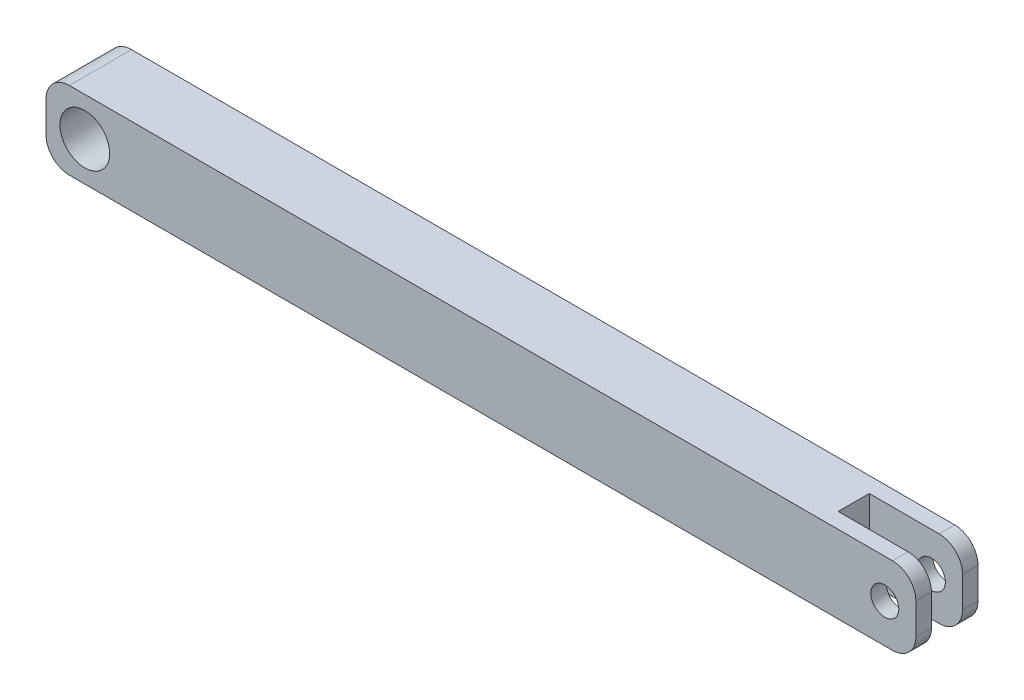
ISO-10303-21;
HEADER;
FILE_DESCRIPTION(('STEP AP214'),'2;1');
FILE_NAME('part.step','',(''),(''),'','','');
FILE_SCHEMA(('AUTOMOTIVE_DESIGN { 1 0 10303 214 1 1 1 1 }'));
ENDSEC;
DATA;
#1=APPLICATION_CONTEXT('core data for automotive mechanical design processes');
#2=APPLICATION_PROTOCOL_DEFINITION('international standard','automotive_design',2000,#1);
#3=PRODUCT_CONTEXT('',#1,'mechanical');
#4=PRODUCT('Part','Part','',(#3));
#5=PRODUCT_RELATED_PRODUCT_CATEGORY('part','',(#4));
#6=PRODUCT_DEFINITION_FORMATION('','',#4);
#7=PRODUCT_DEFINITION_CONTEXT('part definition',#1,'design');
#8=PRODUCT_DEFINITION('design','',#6,#7);
#9=PRODUCT_DEFINITION_SHAPE('','',#8);
#10=(LENGTH_UNIT() NAMED_UNIT(*) SI_UNIT(.MILLI.,.METRE.));
#11=(NAMED_UNIT(*) PLANE_ANGLE_UNIT() SI_UNIT($,.RADIAN.));
#12=(NAMED_UNIT(*) SI_UNIT($,.STERADIAN.) SOLID_ANGLE_UNIT());
#13=UNCERTAINTY_MEASURE_WITH_UNIT(LENGTH_MEASURE(1.E-05),#10,'distance_accuracy_value','');
#14=(GEOMETRIC_REPRESENTATION_CONTEXT(3) GLOBAL_UNCERTAINTY_ASSIGNED_CONTEXT((#13)) GLOBAL_UNIT_ASSIGNED_CONTEXT((#10,
#11,#12)) REPRESENTATION_CONTEXT('',''));
#15=CARTESIAN_POINT('',(0.,0.,0.));
#16=DIRECTION('',(0.,0.,1.));
#17=DIRECTION('',(1.,0.,0.));
#18=AXIS2_PLACEMENT_3D('',#15,#16,#17);
#19=CARTESIAN_POINT('',(56.,5.,3.));
#20=DIRECTION('',(-1.,0.,0.));
#21=DIRECTION('',(0.,0.,1.));
#22=AXIS2_PLACEMENT_3D('',#19,#20,#21);
#23=PLANE('',#22);
#24=DIRECTION('',(0.,0.,-1.));
#25=VECTOR('',#24,1.);
#26=CARTESIAN_POINT('',(56.,1.5,3.));
#27=LINE('',#26,#25);
#28=CARTESIAN_POINT('',(56.,1.5,3.5));
#29=VERTEX_POINT('',#28);
#30=CARTESIAN_POINT('',(56.,1.5,2.5));
#31=VERTEX_POINT('',#30);
#32=EDGE_CURVE('E254',#29,#31,#27,.T.);
#33=ORIENTED_EDGE('',*,*,#32,.T.);
#34=DIRECTION('',(0.,1.,0.));
#35=VECTOR('',#34,1.);
#36=CARTESIAN_POINT('',(56.,5.,2.5));
#37=LINE('',#36,#35);
#38=CARTESIAN_POINT('',(56.,3.5,2.5));
#39=VERTEX_POINT('',#38);
#40=EDGE_CURVE('E185',#31,#39,#37,.T.);
#41=ORIENTED_EDGE('',*,*,#40,.T.);
#42=DIRECTION('',(0.,0.,-1.));
#43=VECTOR('',#42,1.);
#44=CARTESIAN_POINT('',(56.,3.5,3.));
#45=LINE('',#44,#43);
#46=CARTESIAN_POINT('',(56.,3.5,3.5));
#47=VERTEX_POINT('',#46);
#48=EDGE_CURVE('E257',#39,#47,#45,.F.);
#49=ORIENTED_EDGE('',*,*,#48,.T.);
#50=DIRECTION('',(0.,1.,0.));
#51=VECTOR('',#50,1.);
#52=CARTESIAN_POINT('',(56.,1.5,3.5));
#53=LINE('',#52,#51);
#54=EDGE_CURVE('E232',#29,#47,#53,.T.);
#55=ORIENTED_EDGE('',*,*,#54,.F.);
#56=EDGE_LOOP('',(#33,#41,#49,#55));
#57=FACE_BOUND('',#56,.T.);
#58=ADVANCED_FACE('F41',(#57),#23,.F.);
#59=CARTESIAN_POINT('',(54.,2.5,3.001));
#60=DIRECTION('',(0.,0.,-1.));
#61=DIRECTION('',(-1.,0.,0.));
#62=AXIS2_PLACEMENT_3D('',#59,#60,#61);
#63=CYLINDRICAL_SURFACE('',#62,0.900000000000004);
#64=CARTESIAN_POINT('',(54.,2.5,2.5));
#65=DIRECTION('',(0.,0.,1.));
#66=DIRECTION('',(1.,0.,0.));
#67=AXIS2_PLACEMENT_3D('',#64,#65,#66);
#68=CIRCLE('',#67,0.900000000000004);
#69=CARTESIAN_POINT('',(53.1,2.5,2.5));
#70=VERTEX_POINT('',#69);
#71=EDGE_CURVE('E190',#70,#70,#68,.T.);
#72=CARTESIAN_POINT('',(54.,2.5,3.5));
#73=DIRECTION('',(0.,0.,1.));
#74=DIRECTION('',(1.,0.,0.));
#75=AXIS2_PLACEMENT_3D('',#72,#73,#74);
#76=CIRCLE('',#75,0.900000000000004);
#77=CARTESIAN_POINT('',(53.1,2.5,3.5));
#78=VERTEX_POINT('',#77);
#79=EDGE_CURVE('E223',#78,#78,#76,.T.);
#80=CARTESIAN_POINT('',(53.1,2.5,2.5));
#81=CARTESIAN_POINT('',(53.1,2.5,2.51041666666667));
#82=CARTESIAN_POINT('',(53.1,2.5,2.52083333333334));
#83=CARTESIAN_POINT('',(53.1,2.5,2.54166666666667));
#84=CARTESIAN_POINT('',(53.1,2.5,2.55208333333334));
#85=CARTESIAN_POINT('',(53.1,2.5,2.57291666666667));
#86=CARTESIAN_POINT('',(53.1,2.5,2.58333333333334));
#87=CARTESIAN_POINT('',(53.1,2.5,2.60416666666667));
#88=CARTESIAN_POINT('',(53.1,2.5,2.61458333333334));
#89=CARTESIAN_POINT('',(53.1,2.5,2.63541666666667));
#90=CARTESIAN_POINT('',(53.1,2.5,2.64583333333334));
#91=CARTESIAN_POINT('',(53.1,2.5,2.66666666666667));
#92=CARTESIAN_POINT('',(53.1,2.5,2.67708333333334));
#93=CARTESIAN_POINT('',(53.1,2.5,2.69791666666667));
#94=CARTESIAN_POINT('',(53.1,2.5,2.70833333333334));
#95=CARTESIAN_POINT('',(53.1,2.5,2.72916666666667));
#96=CARTESIAN_POINT('',(53.1,2.5,2.73958333333334));
#97=CARTESIAN_POINT('',(53.1,2.5,2.76041666666667));
#98=CARTESIAN_POINT('',(53.1,2.5,2.77083333333334));
#99=CARTESIAN_POINT('',(53.1,2.5,2.79166666666667));
#100=CARTESIAN_POINT('',(53.1,2.5,2.80208333333334));
#101=CARTESIAN_POINT('',(53.1,2.5,2.82291666666667));
#102=CARTESIAN_POINT('',(53.1,2.5,2.83333333333334));
#103=CARTESIAN_POINT('',(53.1,2.5,2.85416666666667));
#104=CARTESIAN_POINT('',(53.1,2.5,2.86458333333334));
#105=CARTESIAN_POINT('',(53.1,2.5,2.88541666666667));
#106=CARTESIAN_POINT('',(53.1,2.5,2.89583333333334));
#107=CARTESIAN_POINT('',(53.1,2.5,2.91666666666667));
#108=CARTESIAN_POINT('',(53.1,2.5,2.92708333333334));
#109=CARTESIAN_POINT('',(53.1,2.5,2.94791666666667));
#110=CARTESIAN_POINT('',(53.1,2.5,2.95833333333333));
#111=CARTESIAN_POINT('',(53.1,2.5,2.97916666666667));
#112=CARTESIAN_POINT('',(53.1,2.5,2.98958333333333));
#113=CARTESIAN_POINT('',(53.1,2.5,3.01041666666667));
#114=CARTESIAN_POINT('',(53.1,2.5,3.02083333333333));
#115=CARTESIAN_POINT('',(53.1,2.5,3.04166666666667));
#116=CARTESIAN_POINT('',(53.1,2.5,3.05208333333333));
#117=CARTESIAN_POINT('',(53.1,2.5,3.07291666666667));
#118=CARTESIAN_POINT('',(53.1,2.5,3.08333333333333));
#119=CARTESIAN_POINT('',(53.1,2.5,3.10416666666667));
#120=CARTESIAN_POINT('',(53.1,2.5,3.11458333333333));
#121=CARTESIAN_POINT('',(53.1,2.5,3.13541666666667));
#122=CARTESIAN_POINT('',(53.1,2.5,3.14583333333333));
#123=CARTESIAN_POINT('',(53.1,2.5,3.16666666666667));
#124=CARTESIAN_POINT('',(53.1,2.5,3.17708333333333));
#125=CARTESIAN_POINT('',(53.1,2.5,3.19791666666667));
#126=CARTESIAN_POINT('',(53.1,2.5,3.20833333333333));
#127=CARTESIAN_POINT('',(53.1,2.5,3.22916666666667));
#128=CARTESIAN_POINT('',(53.1,2.5,3.23958333333333));
#129=CARTESIAN_POINT('',(53.1,2.5,3.26041666666667));
#130=CARTESIAN_POINT('',(53.1,2.5,3.27083333333333));
#131=CARTESIAN_POINT('',(53.1,2.5,3.29166666666667));
#132=CARTESIAN_POINT('',(53.1,2.5,3.30208333333333));
#133=CARTESIAN_POINT('',(53.1,2.5,3.32291666666667));
#134=CARTESIAN_POINT('',(53.1,2.5,3.33333333333333));
#135=CARTESIAN_POINT('',(53.1,2.5,3.35416666666667));
#136=CARTESIAN_POINT('',(53.1,2.5,3.36458333333333));
#137=CARTESIAN_POINT('',(53.1,2.5,3.38541666666667));
#138=CARTESIAN_POINT('',(53.1,2.5,3.39583333333333));
#139=CARTESIAN_POINT('',(53.1,2.5,3.41666666666667));
#140=CARTESIAN_POINT('',(53.1,2.5,3.42708333333333));
#141=CARTESIAN_POINT('',(53.1,2.5,3.44791666666667));
#142=CARTESIAN_POINT('',(53.1,2.5,3.45833333333333));
#143=CARTESIAN_POINT('',(53.1,2.5,3.47916666666667));
#144=CARTESIAN_POINT('',(53.1,2.5,3.48958333333333));
#145=CARTESIAN_POINT('',(53.1,2.5,3.5));
#146=B_SPLINE_CURVE_WITH_KNOTS('',3,(#80,#81,#82,#83,#84,#85,#86,#87,#88,#89,#90,#91,#92,#93,
#94,#95,#96,#97,#98,#99,#100,#101,#102,#103,#104,#105,#106,#107,#108,#109,#110,#111,#112,#113,
#114,#115,#116,#117,#118,#119,#120,#121,#122,#123,#124,#125,#126,#127,#128,#129,#130,#131,#132,
#133,#134,#135,#136,#137,#138,#139,#140,#141,#142,#143,#144,#145),.UNSPECIFIED.,.F.,.F.,(4,2,2,
2,2,2,2,2,2,2,2,2,2,2,2,2,2,2,2,2,2,2,2,2,2,2,2,2,2,2,2,2,4),(0.,0.0312499999999996,
0.0624999999999996,0.0937499999999997,0.124999999999999,0.156249999999999,0.187499999999999,
0.218749999999999,0.249999999999999,0.281249999999999,0.312499999999999,0.343749999999999,
0.374999999999999,0.406249999999999,0.437499999999998,0.468749999999998,0.499999999999998,
0.531249999999998,0.562499999999998,0.593749999999998,0.624999999999998,0.656249999999998,
0.687499999999998,0.718749999999998,0.749999999999997,0.781249999999997,0.812499999999997,
0.843749999999997,0.874999999999997,0.906249999999997,0.937499999999996,0.968749999999997,
0.999999999999997),.UNSPECIFIED.);
#147=EDGE_CURVE('BSEAM320',#70,#78,#146,.T.);
#148=ORIENTED_EDGE('',*,*,#71,.F.);
#149=ORIENTED_EDGE('',*,*,#79,.T.);
#150=ORIENTED_EDGE('',*,*,#147,.T.);
#151=ORIENTED_EDGE('',*,*,#147,.F.);
#152=EDGE_LOOP('',(#148,#150,#149,#151));
#153=FACE_BOUND('',#152,.T.);
#154=ADVANCED_FACE('F320',(#153),#63,.F.);
#155=CARTESIAN_POINT('',(54.5,3.5,0.));
#156=DIRECTION('',(0.,0.,1.));
#157=DIRECTION('',(1.,0.,0.));
#158=AXIS2_PLACEMENT_3D('',#155,#156,#157);
#159=CYLINDRICAL_SURFACE('',#158,1.5);
#160=CARTESIAN_POINT('',(54.5,3.5,2.5));
#161=DIRECTION('',(0.,0.,1.));
#162=DIRECTION('',(1.,0.,0.));
#163=AXIS2_PLACEMENT_3D('',#160,#161,#162);
#164=CIRCLE('',#163,1.5);
#165=CARTESIAN_POINT('',(54.5,5.,2.5));
#166=VERTEX_POINT('',#165);
#167=EDGE_CURVE('E188',#166,#39,#164,.F.);
#168=ORIENTED_EDGE('',*,*,#167,.F.);
#169=DIRECTION('',(0.,0.,-1.));
#170=VECTOR('',#169,1.);
#171=CARTESIAN_POINT('',(54.5,5.,0.));
#172=LINE('',#171,#170);
#173=CARTESIAN_POINT('',(54.5,5.,3.5));
#174=VERTEX_POINT('',#173);
#175=EDGE_CURVE('E167',#174,#166,#172,.T.);
#176=ORIENTED_EDGE('',*,*,#175,.F.);
#177=CARTESIAN_POINT('',(54.5,3.5,3.5));
#178=DIRECTION('',(0.,0.,1.));
#179=DIRECTION('',(1.,0.,0.));
#180=AXIS2_PLACEMENT_3D('',#177,#178,#179);
#181=CIRCLE('',#180,1.5);
#182=EDGE_CURVE('E235',#47,#174,#181,.T.);
#183=ORIENTED_EDGE('',*,*,#182,.F.);
#184=ORIENTED_EDGE('',*,*,#48,.F.);
#185=EDGE_LOOP('',(#168,#176,#183,#184));
#186=FACE_BOUND('',#185,.T.);
#187=ADVANCED_FACE('F298',(#186),#159,.T.);
#188=CARTESIAN_POINT('',(54.5,1.5,3.));
#189=DIRECTION('',(0.,0.,-1.));
#190=DIRECTION('',(-1.,0.,0.));
#191=AXIS2_PLACEMENT_3D('',#188,#189,#190);
#192=CYLINDRICAL_SURFACE('',#191,1.5);
#193=CARTESIAN_POINT('',(54.5,1.5,2.5));
#194=DIRECTION('',(0.,0.,1.));
#195=DIRECTION('',(1.,0.,0.));
#196=AXIS2_PLACEMENT_3D('',#193,#194,#195);
#197=CIRCLE('',#196,1.5);
#198=CARTESIAN_POINT('',(54.5,0.,2.5));
#199=VERTEX_POINT('',#198);
#200=EDGE_CURVE('E183',#31,#199,#197,.F.);
#201=ORIENTED_EDGE('',*,*,#200,.F.);
#202=ORIENTED_EDGE('',*,*,#32,.F.);
#203=CARTESIAN_POINT('',(54.5,1.5,3.5));
#204=DIRECTION('',(0.,0.,1.));
#205=DIRECTION('',(1.,0.,0.));
#206=AXIS2_PLACEMENT_3D('',#203,#204,#205);
#207=CIRCLE('',#206,1.5);
#208=CARTESIAN_POINT('',(54.5,0.,3.5));
#209=VERTEX_POINT('',#208);
#210=EDGE_CURVE('E229',#209,#29,#207,.T.);
#211=ORIENTED_EDGE('',*,*,#210,.F.);
#212=DIRECTION('',(0.,0.,-1.));
#213=VECTOR('',#212,1.);
#214=CARTESIAN_POINT('',(54.5,0.,0.));
#215=LINE('',#214,#213);
#216=EDGE_CURVE('E55',#199,#209,#215,.F.);
#217=ORIENTED_EDGE('',*,*,#216,.F.);
#218=EDGE_LOOP('',(#201,#202,#211,#217));
#219=FACE_BOUND('',#218,.T.);
#220=ADVANCED_FACE('F292',(#219),#192,.T.);
#221=CARTESIAN_POINT('',(0.,5.,0.));
#222=DIRECTION('',(1.,0.,0.));
#223=DIRECTION('',(0.,0.,-1.));
#224=AXIS2_PLACEMENT_3D('',#221,#222,#223);
#225=PLANE('',#224);
#226=DIRECTION('',(0.,0.,1.));
#227=VECTOR('',#226,1.);
#228=CARTESIAN_POINT('',(0.,3.5,0.));
#229=LINE('',#228,#227);
#230=CARTESIAN_POINT('',(0.,3.5,3.5));
#231=VERTEX_POINT('',#230);
#232=CARTESIAN_POINT('',(0.,3.5,-0.5));
#233=VERTEX_POINT('',#232);
#234=EDGE_CURVE('E265',#231,#233,#229,.F.);
#235=ORIENTED_EDGE('',*,*,#234,.T.);
#236=DIRECTION('',(0.,1.,0.));
#237=VECTOR('',#236,1.);
#238=CARTESIAN_POINT('',(0.,1.5,-0.5));
#239=LINE('',#238,#237);
#240=CARTESIAN_POINT('',(0.,1.5,-0.5));
#241=VERTEX_POINT('',#240);
#242=EDGE_CURVE('E220',#241,#233,#239,.T.);
#243=ORIENTED_EDGE('',*,*,#242,.F.);
#244=DIRECTION('',(0.,0.,1.));
#245=VECTOR('',#244,1.);
#246=CARTESIAN_POINT('',(0.,1.5,0.));
#247=LINE('',#246,#245);
#248=CARTESIAN_POINT('',(0.,1.5,3.5));
#249=VERTEX_POINT('',#248);
#250=EDGE_CURVE('E267',#241,#249,#247,.T.);
#251=ORIENTED_EDGE('',*,*,#250,.T.);
#252=DIRECTION('',(0.,-1.,0.));
#253=VECTOR('',#252,1.);
#254=CARTESIAN_POINT('',(0.,3.5,3.5));
#255=LINE('',#254,#253);
#256=EDGE_CURVE('E244',#231,#249,#255,.T.);
#257=ORIENTED_EDGE('',*,*,#256,.F.);
#258=EDGE_LOOP('',(#235,#243,#251,#257));
#259=FACE_BOUND('',#258,.T.);
#260=ADVANCED_FACE('F310',(#259),#225,.F.);
#261=CARTESIAN_POINT('',(56.,3.5,-0.500000000000004));
#262=VERTEX_POINT('',#261);
#263=CARTESIAN_POINT('',(56.,3.5,0.5));
#264=VERTEX_POINT('',#263);
#265=EDGE_CURVE('E258',#262,#264,#45,.F.);
#266=ORIENTED_EDGE('',*,*,#265,.T.);
#267=DIRECTION('',(0.,-1.,0.));
#268=VECTOR('',#267,1.);
#269=CARTESIAN_POINT('',(56.,5.,0.5));
#270=LINE('',#269,#268);
#271=CARTESIAN_POINT('',(56.,1.5,0.5));
#272=VERTEX_POINT('',#271);
#273=EDGE_CURVE('E175',#264,#272,#270,.T.);
#274=ORIENTED_EDGE('',*,*,#273,.T.);
#275=CARTESIAN_POINT('',(56.,1.5,-0.500000000000004));
#276=VERTEX_POINT('',#275);
#277=EDGE_CURVE('E253',#272,#276,#27,.T.);
#278=ORIENTED_EDGE('',*,*,#277,.T.);
#279=DIRECTION('',(0.,-1.,0.));
#280=VECTOR('',#279,1.);
#281=CARTESIAN_POINT('',(56.,3.5,-0.500000000000004));
#282=LINE('',#281,#280);
#283=EDGE_CURVE('E208',#262,#276,#282,.T.);
#284=ORIENTED_EDGE('',*,*,#283,.F.);
#285=EDGE_LOOP('',(#266,#274,#278,#284));
#286=FACE_BOUND('',#285,.T.);
#287=ADVANCED_FACE('F277',(#286),#23,.F.);
#288=CARTESIAN_POINT('',(0.,5.,0.));
#289=DIRECTION('',(0.,1.,0.));
#290=DIRECTION('',(0.,0.,1.));
#291=AXIS2_PLACEMENT_3D('',#288,#289,#290);
#292=PLANE('',#291);
#293=DIRECTION('',(0.,0.,1.));
#294=VECTOR('',#293,1.);
#295=CARTESIAN_POINT('',(50.,5.,0.700000000000001));
#296=LINE('',#295,#294);
#297=CARTESIAN_POINT('',(50.,5.,0.500000000000001));
#298=VERTEX_POINT('',#297);
#299=CARTESIAN_POINT('',(50.,5.,2.5));
#300=VERTEX_POINT('',#299);
#301=EDGE_CURVE('E144',#298,#300,#296,.T.);
#302=ORIENTED_EDGE('',*,*,#301,.F.);
#303=DIRECTION('',(-1.,0.,0.));
#304=VECTOR('',#303,1.);
#305=CARTESIAN_POINT('',(56.2063900401518,5.,0.5));
#306=LINE('',#305,#304);
#307=CARTESIAN_POINT('',(54.5,5.,0.5));
#308=VERTEX_POINT('',#307);
#309=EDGE_CURVE('E162',#308,#298,#306,.T.);
#310=ORIENTED_EDGE('',*,*,#309,.F.);
#311=CARTESIAN_POINT('',(54.5,5.,-0.500000000000004));
#312=VERTEX_POINT('',#311);
#313=EDGE_CURVE('E251',#308,#312,#172,.T.);
#314=ORIENTED_EDGE('',*,*,#313,.T.);
#315=DIRECTION('',(1.,0.,0.));
#316=VECTOR('',#315,1.);
#317=CARTESIAN_POINT('',(1.5,5.,-0.5));
#318=LINE('',#317,#316);
#319=CARTESIAN_POINT('',(1.5,5.,-0.5));
#320=VERTEX_POINT('',#319);
#321=EDGE_CURVE('E202',#320,#312,#318,.T.);
#322=ORIENTED_EDGE('',*,*,#321,.F.);
#323=DIRECTION('',(0.,0.,1.));
#324=VECTOR('',#323,1.);
#325=CARTESIAN_POINT('',(1.5,5.,3.));
#326=LINE('',#325,#324);
#327=CARTESIAN_POINT('',(1.5,5.,3.5));
#328=VERTEX_POINT('',#327);
#329=EDGE_CURVE('E154',#320,#328,#326,.T.);
#330=ORIENTED_EDGE('',*,*,#329,.T.);
#331=DIRECTION('',(-1.,0.,0.));
#332=VECTOR('',#331,1.);
#333=CARTESIAN_POINT('',(54.5,5.,3.5));
#334=LINE('',#333,#332);
#335=EDGE_CURVE('E238',#174,#328,#334,.T.);
#336=ORIENTED_EDGE('',*,*,#335,.F.);
#337=ORIENTED_EDGE('',*,*,#175,.T.);
#338=DIRECTION('',(1.,0.,0.));
#339=VECTOR('',#338,1.);
#340=CARTESIAN_POINT('',(56.2063900401518,5.,2.5));
#341=LINE('',#340,#339);
#342=EDGE_CURVE('E160',#300,#166,#341,.T.);
#343=ORIENTED_EDGE('',*,*,#342,.F.);
#344=EDGE_LOOP('',(#302,#310,#314,#322,#330,#336,#337,#343));
#345=FACE_BOUND('',#344,.T.);
#346=ADVANCED_FACE('F165',(#345),#292,.T.);
#347=CARTESIAN_POINT('',(0.,0.,0.));
#348=DIRECTION('',(0.,1.,0.));
#349=DIRECTION('',(0.,0.,1.));
#350=AXIS2_PLACEMENT_3D('',#347,#348,#349);
#351=PLANE('',#350);
#352=DIRECTION('',(-1.,0.,0.));
#353=VECTOR('',#352,1.);
#354=CARTESIAN_POINT('',(0.,0.,0.500000000000008));
#355=LINE('',#354,#353);
#356=CARTESIAN_POINT('',(54.5,0.,0.5));
#357=VERTEX_POINT('',#356);
#358=CARTESIAN_POINT('',(50.,0.,0.500000000000001));
#359=VERTEX_POINT('',#358);
#360=EDGE_CURVE('E171',#357,#359,#355,.T.);
#361=ORIENTED_EDGE('',*,*,#360,.T.);
#362=DIRECTION('',(0.,0.,1.));
#363=VECTOR('',#362,1.);
#364=CARTESIAN_POINT('',(50.,0.,0.));
#365=LINE('',#364,#363);
#366=CARTESIAN_POINT('',(50.,0.,2.5));
#367=VERTEX_POINT('',#366);
#368=EDGE_CURVE('E269',#359,#367,#365,.T.);
#369=ORIENTED_EDGE('',*,*,#368,.T.);
#370=DIRECTION('',(1.,0.,0.));
#371=VECTOR('',#370,1.);
#372=CARTESIAN_POINT('',(0.,0.,2.50000000000001));
#373=LINE('',#372,#371);
#374=EDGE_CURVE('E11',#367,#199,#373,.T.);
#375=ORIENTED_EDGE('',*,*,#374,.T.);
#376=ORIENTED_EDGE('',*,*,#216,.T.);
#377=DIRECTION('',(1.,0.,0.));
#378=VECTOR('',#377,1.);
#379=CARTESIAN_POINT('',(1.5,0.,3.5));
#380=LINE('',#379,#378);
#381=CARTESIAN_POINT('',(1.5,0.,3.5));
#382=VERTEX_POINT('',#381);
#383=EDGE_CURVE('E155',#382,#209,#380,.T.);
#384=ORIENTED_EDGE('',*,*,#383,.F.);
#385=DIRECTION('',(0.,0.,1.));
#386=VECTOR('',#385,1.);
#387=CARTESIAN_POINT('',(1.5,0.,0.));
#388=LINE('',#387,#386);
#389=CARTESIAN_POINT('',(1.5,0.,-0.5));
#390=VERTEX_POINT('',#389);
#391=EDGE_CURVE('E63',#382,#390,#388,.F.);
#392=ORIENTED_EDGE('',*,*,#391,.T.);
#393=DIRECTION('',(-1.,0.,0.));
#394=VECTOR('',#393,1.);
#395=CARTESIAN_POINT('',(54.5,0.,-0.500000000000004));
#396=LINE('',#395,#394);
#397=CARTESIAN_POINT('',(54.5,0.,-0.500000000000004));
#398=VERTEX_POINT('',#397);
#399=EDGE_CURVE('E214',#398,#390,#396,.T.);
#400=ORIENTED_EDGE('',*,*,#399,.F.);
#401=EDGE_CURVE('E262',#398,#357,#215,.F.);
#402=ORIENTED_EDGE('',*,*,#401,.T.);
#403=EDGE_LOOP('',(#361,#369,#375,#376,#384,#392,#400,#402));
#404=FACE_BOUND('',#403,.T.);
#405=ADVANCED_FACE('F285',(#404),#351,.F.);
#406=CARTESIAN_POINT('',(2.5,2.5,-0.00100000000000013));
#407=DIRECTION('',(0.,0.,1.));
#408=DIRECTION('',(1.,0.,0.));
#409=AXIS2_PLACEMENT_3D('',#406,#407,#408);
#410=CYLINDRICAL_SURFACE('',#409,1.6);
#411=CARTESIAN_POINT('',(2.5,2.5,3.5));
#412=DIRECTION('',(0.,0.,1.));
#413=DIRECTION('',(1.,0.,0.));
#414=AXIS2_PLACEMENT_3D('',#411,#412,#413);
#415=CIRCLE('',#414,1.6);
#416=CARTESIAN_POINT('',(4.1,2.5,3.5));
#417=VERTEX_POINT('',#416);
#418=EDGE_CURVE('E226',#417,#417,#415,.T.);
#419=CARTESIAN_POINT('',(2.5,2.5,-0.5));
#420=DIRECTION('',(0.,0.,-1.));
#421=DIRECTION('',(-1.,0.,0.));
#422=AXIS2_PLACEMENT_3D('',#419,#420,#421);
#423=CIRCLE('',#422,1.6);
#424=CARTESIAN_POINT('',(4.1,2.5,-0.5));
#425=VERTEX_POINT('',#424);
#426=EDGE_CURVE('E193',#425,#425,#423,.T.);
#427=CARTESIAN_POINT('',(4.1,2.5,3.5));
#428=CARTESIAN_POINT('',(4.1,2.5,3.45833333333333));
#429=CARTESIAN_POINT('',(4.1,2.5,3.41666666666667));
#430=CARTESIAN_POINT('',(4.1,2.5,3.33333333333333));
#431=CARTESIAN_POINT('',(4.1,2.5,3.29166666666667));
#432=CARTESIAN_POINT('',(4.1,2.5,3.20833333333333));
#433=CARTESIAN_POINT('',(4.1,2.5,3.16666666666667));
#434=CARTESIAN_POINT('',(4.1,2.5,3.08333333333333));
#435=CARTESIAN_POINT('',(4.1,2.5,3.04166666666667));
#436=CARTESIAN_POINT('',(4.1,2.5,2.95833333333333));
#437=CARTESIAN_POINT('',(4.1,2.5,2.91666666666667));
#438=CARTESIAN_POINT('',(4.1,2.5,2.83333333333333));
#439=CARTESIAN_POINT('',(4.1,2.5,2.79166666666667));
#440=CARTESIAN_POINT('',(4.1,2.5,2.70833333333333));
#441=CARTESIAN_POINT('',(4.1,2.5,2.66666666666667));
#442=CARTESIAN_POINT('',(4.1,2.5,2.58333333333333));
#443=CARTESIAN_POINT('',(4.1,2.5,2.54166666666667));
#444=CARTESIAN_POINT('',(4.1,2.5,2.45833333333333));
#445=CARTESIAN_POINT('',(4.1,2.5,2.41666666666667));
#446=CARTESIAN_POINT('',(4.1,2.5,2.33333333333333));
#447=CARTESIAN_POINT('',(4.1,2.5,2.29166666666667));
#448=CARTESIAN_POINT('',(4.1,2.5,2.20833333333333));
#449=CARTESIAN_POINT('',(4.1,2.5,2.16666666666667));
#450=CARTESIAN_POINT('',(4.1,2.5,2.08333333333333));
#451=CARTESIAN_POINT('',(4.1,2.5,2.04166666666667));
#452=CARTESIAN_POINT('',(4.1,2.5,1.95833333333333));
#453=CARTESIAN_POINT('',(4.1,2.5,1.91666666666667));
#454=CARTESIAN_POINT('',(4.1,2.5,1.83333333333333));
#455=CARTESIAN_POINT('',(4.1,2.5,1.79166666666667));
#456=CARTESIAN_POINT('',(4.1,2.5,1.70833333333333));
#457=CARTESIAN_POINT('',(4.1,2.5,1.66666666666667));
#458=CARTESIAN_POINT('',(4.1,2.5,1.58333333333333));
#459=CARTESIAN_POINT('',(4.1,2.5,1.54166666666667));
#460=CARTESIAN_POINT('',(4.1,2.5,1.45833333333333));
#461=CARTESIAN_POINT('',(4.1,2.5,1.41666666666667));
#462=CARTESIAN_POINT('',(4.1,2.5,1.33333333333333));
#463=CARTESIAN_POINT('',(4.1,2.5,1.29166666666667));
#464=CARTESIAN_POINT('',(4.1,2.5,1.20833333333333));
#465=CARTESIAN_POINT('',(4.1,2.5,1.16666666666667));
#466=CARTESIAN_POINT('',(4.1,2.5,1.08333333333333));
#467=CARTESIAN_POINT('',(4.1,2.5,1.04166666666667));
#468=CARTESIAN_POINT('',(4.1,2.5,0.958333333333333));
#469=CARTESIAN_POINT('',(4.1,2.5,0.916666666666666));
#470=CARTESIAN_POINT('',(4.1,2.5,0.833333333333333));
#471=CARTESIAN_POINT('',(4.1,2.5,0.791666666666666));
#472=CARTESIAN_POINT('',(4.1,2.5,0.708333333333333));
#473=CARTESIAN_POINT('',(4.1,2.5,0.666666666666666));
#474=CARTESIAN_POINT('',(4.1,2.5,0.583333333333333));
#475=CARTESIAN_POINT('',(4.1,2.5,0.541666666666666));
#476=CARTESIAN_POINT('',(4.1,2.5,0.458333333333333));
#477=CARTESIAN_POINT('',(4.1,2.5,0.416666666666666));
#478=CARTESIAN_POINT('',(4.1,2.5,0.333333333333333));
#479=CARTESIAN_POINT('',(4.1,2.5,0.291666666666666));
#480=CARTESIAN_POINT('',(4.1,2.5,0.208333333333333));
#481=CARTESIAN_POINT('',(4.1,2.5,0.166666666666666));
#482=CARTESIAN_POINT('',(4.1,2.5,0.083333333333333));
#483=CARTESIAN_POINT('',(4.1,2.5,0.0416666666666663));
#484=CARTESIAN_POINT('',(4.1,2.5,-0.0416666666666671));
#485=CARTESIAN_POINT('',(4.1,2.5,-0.0833333333333338));
#486=CARTESIAN_POINT('',(4.1,2.5,-0.166666666666667));
#487=CARTESIAN_POINT('',(4.1,2.5,-0.208333333333334));
#488=CARTESIAN_POINT('',(4.1,2.5,-0.291666666666667));
#489=CARTESIAN_POINT('',(4.1,2.5,-0.333333333333334));
#490=CARTESIAN_POINT('',(4.1,2.5,-0.416666666666667));
#491=CARTESIAN_POINT('',(4.1,2.5,-0.458333333333334));
#492=CARTESIAN_POINT('',(4.1,2.5,-0.5));
#493=B_SPLINE_CURVE_WITH_KNOTS('',3,(#427,#428,#429,#430,#431,#432,#433,#434,#435,#436,#437,
#438,#439,#440,#441,#442,#443,#444,#445,#446,#447,#448,#449,#450,#451,#452,#453,#454,#455,#456,
#457,#458,#459,#460,#461,#462,#463,#464,#465,#466,#467,#468,#469,#470,#471,#472,#473,#474,#475,
#476,#477,#478,#479,#480,#481,#482,#483,#484,#485,#486,#487,#488,#489,#490,#491,#492),
.UNSPECIFIED.,.F.,.F.,(4,2,2,2,2,2,2,2,2,2,2,2,2,2,2,2,2,2,2,2,2,2,2,2,2,2,2,2,2,2,2,2,4),(0.,
0.125,0.25,0.375,0.5,0.625,0.75,0.875,1.,1.125,1.25,1.375,1.5,1.625,1.75,1.875,2.,2.125,2.25,
2.375,2.5,2.625,2.75,2.875,3.,3.125,3.25,3.375,3.5,3.625,3.75,3.875,4.),.UNSPECIFIED.);
#494=EDGE_CURVE('BSEAM346',#417,#425,#493,.T.);
#495=ORIENTED_EDGE('',*,*,#418,.T.);
#496=ORIENTED_EDGE('',*,*,#426,.T.);
#497=ORIENTED_EDGE('',*,*,#494,.T.);
#498=ORIENTED_EDGE('',*,*,#494,.F.);
#499=EDGE_LOOP('',(#495,#497,#496,#498));
#500=FACE_BOUND('',#499,.T.);
#501=ADVANCED_FACE('F346',(#500),#410,.F.);
#502=CARTESIAN_POINT('',(54.,2.5,0.5));
#503=DIRECTION('',(0.,0.,-1.));
#504=DIRECTION('',(-1.,0.,0.));
#505=AXIS2_PLACEMENT_3D('',#502,#503,#504);
#506=CIRCLE('',#505,0.900000000000004);
#507=CARTESIAN_POINT('',(53.1,2.5,0.500000000000001));
#508=VERTEX_POINT('',#507);
#509=EDGE_CURVE('E180',#508,#508,#506,.T.);
#510=CARTESIAN_POINT('',(54.,2.5,-0.500000000000004));
#511=DIRECTION('',(0.,0.,-1.));
#512=DIRECTION('',(-1.,0.,0.));
#513=AXIS2_PLACEMENT_3D('',#510,#511,#512);
#514=CIRCLE('',#513,0.900000000000004);
#515=CARTESIAN_POINT('',(53.1,2.5,-0.500000000000003));
#516=VERTEX_POINT('',#515);
#517=EDGE_CURVE('E196',#516,#516,#514,.T.);
#518=CARTESIAN_POINT('',(53.1,2.5,0.500000000000001));
#519=CARTESIAN_POINT('',(53.1,2.5,0.489583333333334));
#520=CARTESIAN_POINT('',(53.1,2.5,0.479166666666668));
#521=CARTESIAN_POINT('',(53.1,2.5,0.458333333333334));
#522=CARTESIAN_POINT('',(53.1,2.5,0.447916666666667));
#523=CARTESIAN_POINT('',(53.1,2.5,0.427083333333334));
#524=CARTESIAN_POINT('',(53.1,2.5,0.416666666666667));
#525=CARTESIAN_POINT('',(53.1,2.5,0.395833333333334));
#526=CARTESIAN_POINT('',(53.1,2.5,0.385416666666667));
#527=CARTESIAN_POINT('',(53.1,2.5,0.364583333333334));
#528=CARTESIAN_POINT('',(53.1,2.5,0.354166666666667));
#529=CARTESIAN_POINT('',(53.1,2.5,0.333333333333333));
#530=CARTESIAN_POINT('',(53.1,2.5,0.322916666666667));
#531=CARTESIAN_POINT('',(53.1,2.5,0.302083333333333));
#532=CARTESIAN_POINT('',(53.1,2.5,0.291666666666666));
#533=CARTESIAN_POINT('',(53.1,2.5,0.270833333333333));
#534=CARTESIAN_POINT('',(53.1,2.5,0.260416666666666));
#535=CARTESIAN_POINT('',(53.1,2.5,0.239583333333333));
#536=CARTESIAN_POINT('',(53.1,2.5,0.229166666666666));
#537=CARTESIAN_POINT('',(53.1,2.5,0.208333333333333));
#538=CARTESIAN_POINT('',(53.1,2.5,0.197916666666666));
#539=CARTESIAN_POINT('',(53.1,2.5,0.177083333333333));
#540=CARTESIAN_POINT('',(53.1,2.5,0.166666666666666));
#541=CARTESIAN_POINT('',(53.1,2.5,0.145833333333333));
#542=CARTESIAN_POINT('',(53.1,2.5,0.135416666666666));
#543=CARTESIAN_POINT('',(53.1,2.5,0.114583333333333));
#544=CARTESIAN_POINT('',(53.1,2.5,0.104166666666666));
#545=CARTESIAN_POINT('',(53.1,2.5,0.0833333333333324));
#546=CARTESIAN_POINT('',(53.1,2.5,0.0729166666666656));
#547=CARTESIAN_POINT('',(53.1,2.5,0.0520833333333321));
#548=CARTESIAN_POINT('',(53.1,2.5,0.0416666666666654));
#549=CARTESIAN_POINT('',(53.1,2.5,0.020833333333332));
#550=CARTESIAN_POINT('',(53.1,2.5,0.0104166666666654));
#551=CARTESIAN_POINT('',(53.1,2.5,-0.010416666666668));
#552=CARTESIAN_POINT('',(53.1,2.5,-0.0208333333333347));
#553=CARTESIAN_POINT('',(53.1,2.5,-0.041666666666668));
#554=CARTESIAN_POINT('',(53.1,2.5,-0.0520833333333347));
#555=CARTESIAN_POINT('',(53.1,2.5,-0.0729166666666682));
#556=CARTESIAN_POINT('',(53.1,2.5,-0.083333333333335));
#557=CARTESIAN_POINT('',(53.1,2.5,-0.104166666666668));
#558=CARTESIAN_POINT('',(53.1,2.5,-0.114583333333335));
#559=CARTESIAN_POINT('',(53.1,2.5,-0.135416666666669));
#560=CARTESIAN_POINT('',(53.1,2.5,-0.145833333333335));
#561=CARTESIAN_POINT('',(53.1,2.5,-0.166666666666669));
#562=CARTESIAN_POINT('',(53.1,2.5,-0.177083333333336));
#563=CARTESIAN_POINT('',(53.1,2.5,-0.197916666666669));
#564=CARTESIAN_POINT('',(53.1,2.5,-0.208333333333336));
#565=CARTESIAN_POINT('',(53.1,2.5,-0.229166666666669));
#566=CARTESIAN_POINT('',(53.1,2.5,-0.239583333333336));
#567=CARTESIAN_POINT('',(53.1,2.5,-0.260416666666669));
#568=CARTESIAN_POINT('',(53.1,2.5,-0.270833333333336));
#569=CARTESIAN_POINT('',(53.1,2.5,-0.291666666666669));
#570=CARTESIAN_POINT('',(53.1,2.5,-0.302083333333336));
#571=CARTESIAN_POINT('',(53.1,2.5,-0.322916666666669));
#572=CARTESIAN_POINT('',(53.1,2.5,-0.333333333333336));
#573=CARTESIAN_POINT('',(53.1,2.5,-0.35416666666667));
#574=CARTESIAN_POINT('',(53.1,2.5,-0.364583333333336));
#575=CARTESIAN_POINT('',(53.1,2.5,-0.38541666666667));
#576=CARTESIAN_POINT('',(53.1,2.5,-0.395833333333336));
#577=CARTESIAN_POINT('',(53.1,2.5,-0.41666666666667));
#578=CARTESIAN_POINT('',(53.1,2.5,-0.427083333333337));
#579=CARTESIAN_POINT('',(53.1,2.5,-0.44791666666667));
#580=CARTESIAN_POINT('',(53.1,2.5,-0.458333333333337));
#581=CARTESIAN_POINT('',(53.1,2.5,-0.47916666666667));
#582=CARTESIAN_POINT('',(53.1,2.5,-0.489583333333337));
#583=CARTESIAN_POINT('',(53.1,2.5,-0.500000000000003));
#584=B_SPLINE_CURVE_WITH_KNOTS('',3,(#518,#519,#520,#521,#522,#523,#524,#525,#526,#527,#528,
#529,#530,#531,#532,#533,#534,#535,#536,#537,#538,#539,#540,#541,#542,#543,#544,#545,#546,#547,
#548,#549,#550,#551,#552,#553,#554,#555,#556,#557,#558,#559,#560,#561,#562,#563,#564,#565,#566,
#567,#568,#569,#570,#571,#572,#573,#574,#575,#576,#577,#578,#579,#580,#581,#582,#583),
.UNSPECIFIED.,.F.,.F.,(4,2,2,2,2,2,2,2,2,2,2,2,2,2,2,2,2,2,2,2,2,2,2,2,2,2,2,2,2,2,2,2,4),(0.,
0.03125,0.0625000000000001,0.0937500000000005,0.125000000000001,0.156250000000001,
0.187500000000001,0.218750000000001,0.250000000000001,0.281250000000001,0.312500000000001,
0.343750000000002,0.375000000000002,0.406250000000002,0.437500000000002,0.468750000000002,
0.500000000000002,0.531250000000002,0.562500000000002,0.593750000000003,0.625000000000003,
0.656250000000003,0.687500000000003,0.718750000000003,0.750000000000003,0.781250000000003,
0.812500000000003,0.843750000000004,0.875000000000004,0.906250000000004,0.937500000000004,
0.968750000000004,1.),.UNSPECIFIED.);
#585=EDGE_CURVE('BSEAM328',#508,#516,#584,.T.);
#586=ORIENTED_EDGE('',*,*,#509,.F.);
#587=ORIENTED_EDGE('',*,*,#517,.T.);
#588=ORIENTED_EDGE('',*,*,#585,.T.);
#589=ORIENTED_EDGE('',*,*,#585,.F.);
#590=EDGE_LOOP('',(#586,#588,#587,#589));
#591=FACE_BOUND('',#590,.T.);
#592=ADVANCED_FACE('F328',(#591),#63,.F.);
#593=CARTESIAN_POINT('',(54.5,3.5,0.5));
#594=DIRECTION('',(0.,0.,-1.));
#595=DIRECTION('',(-1.,0.,0.));
#596=AXIS2_PLACEMENT_3D('',#593,#594,#595);
#597=CIRCLE('',#596,1.5);
#598=EDGE_CURVE('E178',#264,#308,#597,.F.);
#599=ORIENTED_EDGE('',*,*,#598,.F.);
#600=ORIENTED_EDGE('',*,*,#265,.F.);
#601=CARTESIAN_POINT('',(54.5,3.5,-0.500000000000004));
#602=DIRECTION('',(0.,0.,-1.));
#603=DIRECTION('',(-1.,0.,0.));
#604=AXIS2_PLACEMENT_3D('',#601,#602,#603);
#605=CIRCLE('',#604,1.5);
#606=EDGE_CURVE('E205',#312,#262,#605,.T.);
#607=ORIENTED_EDGE('',*,*,#606,.F.);
#608=ORIENTED_EDGE('',*,*,#313,.F.);
#609=EDGE_LOOP('',(#599,#600,#607,#608));
#610=FACE_BOUND('',#609,.T.);
#611=ADVANCED_FACE('F303',(#610),#159,.T.);
#612=CARTESIAN_POINT('',(54.5,1.5,0.5));
#613=DIRECTION('',(0.,0.,-1.));
#614=DIRECTION('',(-1.,0.,0.));
#615=AXIS2_PLACEMENT_3D('',#612,#613,#614);
#616=CIRCLE('',#615,1.5);
#617=EDGE_CURVE('E49',#357,#272,#616,.F.);
#618=ORIENTED_EDGE('',*,*,#617,.F.);
#619=ORIENTED_EDGE('',*,*,#401,.F.);
#620=CARTESIAN_POINT('',(54.5,1.5,-0.500000000000004));
#621=DIRECTION('',(0.,0.,-1.));
#622=DIRECTION('',(-1.,0.,0.));
#623=AXIS2_PLACEMENT_3D('',#620,#621,#622);
#624=CIRCLE('',#623,1.5);
#625=EDGE_CURVE('E211',#276,#398,#624,.T.);
#626=ORIENTED_EDGE('',*,*,#625,.F.);
#627=ORIENTED_EDGE('',*,*,#277,.F.);
#628=EDGE_LOOP('',(#618,#619,#626,#627));
#629=FACE_BOUND('',#628,.T.);
#630=ADVANCED_FACE('F280',(#629),#192,.T.);
#631=CARTESIAN_POINT('',(1.5,1.5,0.));
#632=DIRECTION('',(0.,0.,1.));
#633=DIRECTION('',(1.,0.,0.));
#634=AXIS2_PLACEMENT_3D('',#631,#632,#633);
#635=CYLINDRICAL_SURFACE('',#634,1.5);
#636=ORIENTED_EDGE('',*,*,#250,.F.);
#637=CARTESIAN_POINT('',(1.5,1.5,-0.5));
#638=DIRECTION('',(0.,0.,-1.));
#639=DIRECTION('',(-1.,0.,0.));
#640=AXIS2_PLACEMENT_3D('',#637,#638,#639);
#641=CIRCLE('',#640,1.5);
#642=EDGE_CURVE('E217',#390,#241,#641,.T.);
#643=ORIENTED_EDGE('',*,*,#642,.F.);
#644=ORIENTED_EDGE('',*,*,#391,.F.);
#645=CARTESIAN_POINT('',(1.5,1.5,3.5));
#646=DIRECTION('',(0.,0.,1.));
#647=DIRECTION('',(1.,0.,0.));
#648=AXIS2_PLACEMENT_3D('',#645,#646,#647);
#649=CIRCLE('',#648,1.5);
#650=EDGE_CURVE('E247',#249,#382,#649,.T.);
#651=ORIENTED_EDGE('',*,*,#650,.F.);
#652=EDGE_LOOP('',(#636,#643,#644,#651));
#653=FACE_BOUND('',#652,.T.);
#654=ADVANCED_FACE('F311',(#653),#635,.T.);
#655=CARTESIAN_POINT('',(1.5,3.5,0.));
#656=DIRECTION('',(0.,0.,-1.));
#657=DIRECTION('',(-1.,0.,0.));
#658=AXIS2_PLACEMENT_3D('',#655,#656,#657);
#659=CYLINDRICAL_SURFACE('',#658,1.5);
#660=ORIENTED_EDGE('',*,*,#329,.F.);
#661=CARTESIAN_POINT('',(1.5,3.5,-0.5));
#662=DIRECTION('',(0.,0.,-1.));
#663=DIRECTION('',(-1.,0.,0.));
#664=AXIS2_PLACEMENT_3D('',#661,#662,#663);
#665=CIRCLE('',#664,1.5);
#666=EDGE_CURVE('E199',#233,#320,#665,.T.);
#667=ORIENTED_EDGE('',*,*,#666,.F.);
#668=ORIENTED_EDGE('',*,*,#234,.F.);
#669=CARTESIAN_POINT('',(1.5,3.5,3.5));
#670=DIRECTION('',(0.,0.,1.));
#671=DIRECTION('',(1.,0.,0.));
#672=AXIS2_PLACEMENT_3D('',#669,#670,#671);
#673=CIRCLE('',#672,1.5);
#674=EDGE_CURVE('E241',#328,#231,#673,.T.);
#675=ORIENTED_EDGE('',*,*,#674,.F.);
#676=EDGE_LOOP('',(#660,#667,#668,#675));
#677=FACE_BOUND('',#676,.T.);
#678=ADVANCED_FACE('F43',(#677),#659,.T.);
#679=CARTESIAN_POINT('',(50.,-5.,0.700000000000001));
#680=DIRECTION('',(-1.,0.,0.));
#681=DIRECTION('',(0.,0.,1.));
#682=AXIS2_PLACEMENT_3D('',#679,#680,#681);
#683=PLANE('',#682);
#684=ORIENTED_EDGE('',*,*,#368,.F.);
#685=DIRECTION('',(0.,1.,0.));
#686=VECTOR('',#685,1.);
#687=CARTESIAN_POINT('',(50.,-5.,0.500000000000001));
#688=LINE('',#687,#686);
#689=EDGE_CURVE('E149',#359,#298,#688,.T.);
#690=ORIENTED_EDGE('',*,*,#689,.T.);
#691=ORIENTED_EDGE('',*,*,#301,.T.);
#692=DIRECTION('',(0.,1.,0.));
#693=VECTOR('',#692,1.);
#694=CARTESIAN_POINT('',(50.,-5.,2.5));
#695=LINE('',#694,#693);
#696=EDGE_CURVE('E147',#367,#300,#695,.T.);
#697=ORIENTED_EDGE('',*,*,#696,.F.);
#698=EDGE_LOOP('',(#684,#690,#691,#697));
#699=FACE_BOUND('',#698,.T.);
#700=ADVANCED_FACE('F146',(#699),#683,.F.);
#701=CARTESIAN_POINT('',(54.5,1.5,3.5));
#702=DIRECTION('',(0.,0.,1.));
#703=DIRECTION('',(1.,0.,0.));
#704=AXIS2_PLACEMENT_3D('',#701,#702,#703);
#705=PLANE('',#704);
#706=ORIENTED_EDGE('',*,*,#418,.F.);
#707=EDGE_LOOP('',(#706));
#708=FACE_BOUND('',#707,.T.);
#709=ORIENTED_EDGE('',*,*,#210,.T.);
#710=ORIENTED_EDGE('',*,*,#54,.T.);
#711=ORIENTED_EDGE('',*,*,#182,.T.);
#712=ORIENTED_EDGE('',*,*,#335,.T.);
#713=ORIENTED_EDGE('',*,*,#674,.T.);
#714=ORIENTED_EDGE('',*,*,#256,.T.);
#715=ORIENTED_EDGE('',*,*,#650,.T.);
#716=ORIENTED_EDGE('',*,*,#383,.T.);
#717=EDGE_LOOP('',(#709,#710,#711,#712,#713,#714,#715,#716));
#718=FACE_BOUND('',#717,.T.);
#719=ORIENTED_EDGE('',*,*,#79,.F.);
#720=EDGE_LOOP('',(#719));
#721=FACE_BOUND('',#720,.T.);
#722=ADVANCED_FACE('F288',(#708,#718,#721),#705,.T.);
#723=CARTESIAN_POINT('',(1.5,3.5,-0.5));
#724=DIRECTION('',(0.,0.,-1.));
#725=DIRECTION('',(-1.,0.,0.));
#726=AXIS2_PLACEMENT_3D('',#723,#724,#725);
#727=PLANE('',#726);
#728=ORIENTED_EDGE('',*,*,#517,.F.);
#729=EDGE_LOOP('',(#728));
#730=FACE_BOUND('',#729,.T.);
#731=ORIENTED_EDGE('',*,*,#666,.T.);
#732=ORIENTED_EDGE('',*,*,#321,.T.);
#733=ORIENTED_EDGE('',*,*,#606,.T.);
#734=ORIENTED_EDGE('',*,*,#283,.T.);
#735=ORIENTED_EDGE('',*,*,#625,.T.);
#736=ORIENTED_EDGE('',*,*,#399,.T.);
#737=ORIENTED_EDGE('',*,*,#642,.T.);
#738=ORIENTED_EDGE('',*,*,#242,.T.);
#739=EDGE_LOOP('',(#731,#732,#733,#734,#735,#736,#737,#738));
#740=FACE_BOUND('',#739,.T.);
#741=ORIENTED_EDGE('',*,*,#426,.F.);
#742=EDGE_LOOP('',(#741));
#743=FACE_BOUND('',#742,.T.);
#744=ADVANCED_FACE('F283',(#730,#740,#743),#727,.T.);
#745=CARTESIAN_POINT('',(56.2063900401518,-5.,0.5));
#746=DIRECTION('',(0.,0.,-1.));
#747=DIRECTION('',(-1.,0.,0.));
#748=AXIS2_PLACEMENT_3D('',#745,#746,#747);
#749=PLANE('',#748);
#750=ORIENTED_EDGE('',*,*,#509,.T.);
#751=EDGE_LOOP('',(#750));
#752=FACE_BOUND('',#751,.T.);
#753=ORIENTED_EDGE('',*,*,#598,.T.);
#754=ORIENTED_EDGE('',*,*,#309,.T.);
#755=ORIENTED_EDGE('',*,*,#689,.F.);
#756=ORIENTED_EDGE('',*,*,#360,.F.);
#757=ORIENTED_EDGE('',*,*,#617,.T.);
#758=ORIENTED_EDGE('',*,*,#273,.F.);
#759=EDGE_LOOP('',(#753,#754,#755,#756,#757,#758));
#760=FACE_BOUND('',#759,.T.);
#761=ADVANCED_FACE('F272',(#752,#760),#749,.F.);
#762=CARTESIAN_POINT('',(56.2063900401518,-5.,2.5));
#763=DIRECTION('',(0.,0.,1.));
#764=DIRECTION('',(1.,0.,0.));
#765=AXIS2_PLACEMENT_3D('',#762,#763,#764);
#766=PLANE('',#765);
#767=ORIENTED_EDGE('',*,*,#71,.T.);
#768=EDGE_LOOP('',(#767));
#769=FACE_BOUND('',#768,.T.);
#770=ORIENTED_EDGE('',*,*,#167,.T.);
#771=ORIENTED_EDGE('',*,*,#40,.F.);
#772=ORIENTED_EDGE('',*,*,#200,.T.);
#773=ORIENTED_EDGE('',*,*,#374,.F.);
#774=ORIENTED_EDGE('',*,*,#696,.T.);
#775=ORIENTED_EDGE('',*,*,#342,.T.);
#776=EDGE_LOOP('',(#770,#771,#772,#773,#774,#775));
#777=FACE_BOUND('',#776,.T.);
#778=ADVANCED_FACE('F159',(#769,#777),#766,.F.);
#779=CLOSED_SHELL('',(#58,#154,#187,#220,#260,#287,#346,#405,#501,#592,#611,#630,#654,#678,#700,
#722,#744,#761,#778));
#780=MANIFOLD_SOLID_BREP('B2',#779);
#781=ADVANCED_BREP_SHAPE_REPRESENTATION('',(#18,#780),#14);
#782=SHAPE_DEFINITION_REPRESENTATION(#9,#781);
ENDSEC;
END-ISO-10303-21;
